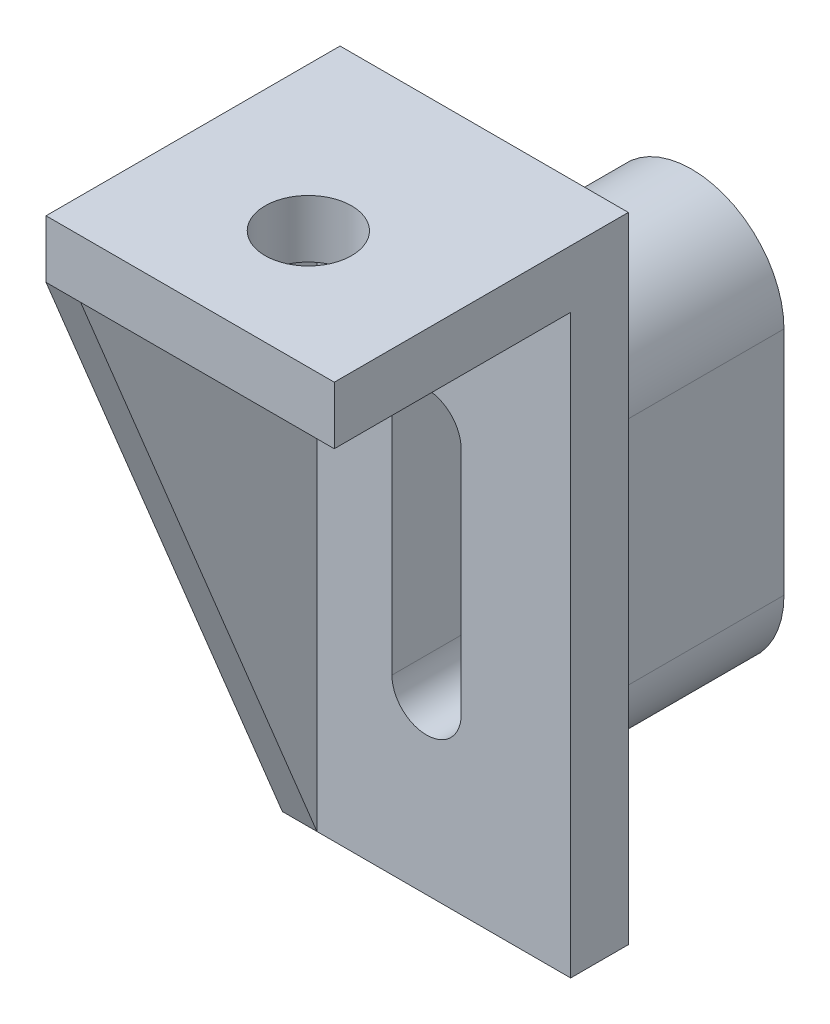
ISO-10303-21;
HEADER;
FILE_DESCRIPTION(('STEP AP214'),'2;1');
FILE_NAME('part.step','',(''),(''),'','','');
FILE_SCHEMA(('AUTOMOTIVE_DESIGN { 1 0 10303 214 1 1 1 1 }'));
ENDSEC;
DATA;
#1=APPLICATION_CONTEXT('core data for automotive mechanical design processes');
#2=APPLICATION_PROTOCOL_DEFINITION('international standard','automotive_design',2000,#1);
#3=PRODUCT_CONTEXT('',#1,'mechanical');
#4=PRODUCT('Part','Part','',(#3));
#5=PRODUCT_RELATED_PRODUCT_CATEGORY('part','',(#4));
#6=PRODUCT_DEFINITION_FORMATION('','',#4);
#7=PRODUCT_DEFINITION_CONTEXT('part definition',#1,'design');
#8=PRODUCT_DEFINITION('design','',#6,#7);
#9=PRODUCT_DEFINITION_SHAPE('','',#8);
#10=(LENGTH_UNIT() NAMED_UNIT(*) SI_UNIT(.MILLI.,.METRE.));
#11=(NAMED_UNIT(*) PLANE_ANGLE_UNIT() SI_UNIT($,.RADIAN.));
#12=(NAMED_UNIT(*) SI_UNIT($,.STERADIAN.) SOLID_ANGLE_UNIT());
#13=UNCERTAINTY_MEASURE_WITH_UNIT(LENGTH_MEASURE(1.E-05),#10,'distance_accuracy_value','');
#14=(GEOMETRIC_REPRESENTATION_CONTEXT(3) GLOBAL_UNCERTAINTY_ASSIGNED_CONTEXT((#13)) GLOBAL_UNIT_ASSIGNED_CONTEXT((#10,
#11,#12)) REPRESENTATION_CONTEXT('',''));
#15=CARTESIAN_POINT('',(0.,0.,0.));
#16=DIRECTION('',(0.,0.,1.));
#17=DIRECTION('',(1.,0.,0.));
#18=AXIS2_PLACEMENT_3D('',#15,#16,#17);
#19=CARTESIAN_POINT('',(0.,0.,10.));
#20=DIRECTION('',(0.,0.,1.));
#21=DIRECTION('',(1.,0.,0.));
#22=AXIS2_PLACEMENT_3D('',#19,#20,#21);
#23=PLANE('',#22);
#24=CARTESIAN_POINT('',(0.,20.,10.));
#25=DIRECTION('',(0.,0.,1.));
#26=DIRECTION('',(1.,0.,0.));
#27=AXIS2_PLACEMENT_3D('',#24,#25,#26);
#28=CIRCLE('',#27,6.00000000000001);
#29=CARTESIAN_POINT('',(5.99999999999999,20.,10.));
#30=VERTEX_POINT('',#29);
#31=CARTESIAN_POINT('',(-6.00000000000002,20.,10.));
#32=VERTEX_POINT('',#31);
#33=EDGE_CURVE('E247',#30,#32,#28,.T.);
#34=ORIENTED_EDGE('',*,*,#33,.F.);
#35=DIRECTION('',(0.,1.,0.));
#36=VECTOR('',#35,1.);
#37=CARTESIAN_POINT('',(6.,0.,10.));
#38=LINE('',#37,#36);
#39=CARTESIAN_POINT('',(6.,-20.,10.));
#40=VERTEX_POINT('',#39);
#41=EDGE_CURVE('E250',#40,#30,#38,.T.);
#42=ORIENTED_EDGE('',*,*,#41,.F.);
#43=CARTESIAN_POINT('',(0.,-20.,10.));
#44=DIRECTION('',(0.,0.,1.));
#45=DIRECTION('',(1.,0.,0.));
#46=AXIS2_PLACEMENT_3D('',#43,#44,#45);
#47=CIRCLE('',#46,6.00000000000001);
#48=CARTESIAN_POINT('',(-6.00000000000001,-20.,10.));
#49=VERTEX_POINT('',#48);
#50=EDGE_CURVE('E254',#49,#40,#47,.T.);
#51=ORIENTED_EDGE('',*,*,#50,.F.);
#52=DIRECTION('',(0.,1.,0.));
#53=VECTOR('',#52,1.);
#54=CARTESIAN_POINT('',(-6.00000000000002,0.,10.));
#55=LINE('',#54,#53);
#56=EDGE_CURVE('E257',#49,#32,#55,.T.);
#57=ORIENTED_EDGE('',*,*,#56,.T.);
#58=EDGE_LOOP('',(#34,#42,#51,#57));
#59=FACE_BOUND('',#58,.T.);
#60=DIRECTION('',(1.,0.,0.));
#61=VECTOR('',#60,1.);
#62=CARTESIAN_POINT('',(0.,50.,10.));
#63=LINE('',#62,#61);
#64=CARTESIAN_POINT('',(-19.,50.,10.));
#65=VERTEX_POINT('',#64);
#66=CARTESIAN_POINT('',(25.,50.,10.));
#67=VERTEX_POINT('',#66);
#68=EDGE_CURVE('E41',#65,#67,#63,.T.);
#69=ORIENTED_EDGE('',*,*,#68,.F.);
#70=DIRECTION('',(0.,-1.,0.));
#71=VECTOR('',#70,1.);
#72=CARTESIAN_POINT('',(-19.,-50.,10.));
#73=LINE('',#72,#71);
#74=CARTESIAN_POINT('',(-19.,-50.,10.));
#75=VERTEX_POINT('',#74);
#76=EDGE_CURVE('E55',#65,#75,#73,.T.);
#77=ORIENTED_EDGE('',*,*,#76,.T.);
#78=DIRECTION('',(1.,0.,0.));
#79=VECTOR('',#78,1.);
#80=CARTESIAN_POINT('',(0.,-50.,10.));
#81=LINE('',#80,#79);
#82=CARTESIAN_POINT('',(25.,-50.,10.));
#83=VERTEX_POINT('',#82);
#84=EDGE_CURVE('E259',#75,#83,#81,.T.);
#85=ORIENTED_EDGE('',*,*,#84,.T.);
#86=DIRECTION('',(0.,1.,0.));
#87=VECTOR('',#86,1.);
#88=CARTESIAN_POINT('',(25.,0.,10.));
#89=LINE('',#88,#87);
#90=EDGE_CURVE('E261',#83,#67,#89,.T.);
#91=ORIENTED_EDGE('',*,*,#90,.T.);
#92=EDGE_LOOP('',(#69,#77,#85,#91));
#93=FACE_BOUND('',#92,.T.);
#94=ADVANCED_FACE('F37',(#59,#93),#23,.T.);
#95=CARTESIAN_POINT('',(25.,50.,51.));
#96=DIRECTION('',(0.,-1.,0.));
#97=DIRECTION('',(0.,0.,-1.));
#98=AXIS2_PLACEMENT_3D('',#95,#96,#97);
#99=PLANE('',#98);
#100=CARTESIAN_POINT('',(0.,50.,30.5));
#101=DIRECTION('',(0.,-1.,0.));
#102=DIRECTION('',(0.,0.,-1.));
#103=AXIS2_PLACEMENT_3D('',#100,#101,#102);
#104=CIRCLE('',#103,7.5);
#105=CARTESIAN_POINT('',(0.,50.,23.));
#106=VERTEX_POINT('',#105);
#107=EDGE_CURVE('E169',#106,#106,#104,.T.);
#108=ORIENTED_EDGE('',*,*,#107,.F.);
#109=EDGE_LOOP('',(#108));
#110=FACE_BOUND('',#109,.T.);
#111=DIRECTION('',(-1.,0.,0.));
#112=VECTOR('',#111,1.);
#113=CARTESIAN_POINT('',(25.,50.,51.));
#114=LINE('',#113,#112);
#115=CARTESIAN_POINT('',(25.,50.,51.));
#116=VERTEX_POINT('',#115);
#117=CARTESIAN_POINT('',(-19.,50.,51.));
#118=VERTEX_POINT('',#117);
#119=EDGE_CURVE('E159',#116,#118,#114,.T.);
#120=ORIENTED_EDGE('',*,*,#119,.T.);
#121=DIRECTION('',(0.,0.,-1.));
#122=VECTOR('',#121,1.);
#123=CARTESIAN_POINT('',(-19.,50.,10.));
#124=LINE('',#123,#122);
#125=EDGE_CURVE('E63',#118,#65,#124,.T.);
#126=ORIENTED_EDGE('',*,*,#125,.T.);
#127=ORIENTED_EDGE('',*,*,#68,.T.);
#128=DIRECTION('',(0.,0.,-1.));
#129=VECTOR('',#128,1.);
#130=CARTESIAN_POINT('',(25.,50.,51.));
#131=LINE('',#130,#129);
#132=EDGE_CURVE('E190',#116,#67,#131,.T.);
#133=ORIENTED_EDGE('',*,*,#132,.F.);
#134=EDGE_LOOP('',(#120,#126,#127,#133));
#135=FACE_BOUND('',#134,.T.);
#136=ADVANCED_FACE('F281',(#110,#135),#99,.T.);
#137=CARTESIAN_POINT('',(0.,0.,0.));
#138=DIRECTION('',(0.,0.,1.));
#139=DIRECTION('',(1.,0.,0.));
#140=AXIS2_PLACEMENT_3D('',#137,#138,#139);
#141=PLANE('',#140);
#142=DIRECTION('',(1.,0.,0.));
#143=VECTOR('',#142,1.);
#144=CARTESIAN_POINT('',(0.,-50.,0.));
#145=LINE('',#144,#143);
#146=CARTESIAN_POINT('',(-25.,-50.,0.));
#147=VERTEX_POINT('',#146);
#148=CARTESIAN_POINT('',(25.,-50.,0.));
#149=VERTEX_POINT('',#148);
#150=EDGE_CURVE('E240',#147,#149,#145,.T.);
#151=ORIENTED_EDGE('',*,*,#150,.F.);
#152=DIRECTION('',(0.,1.,0.));
#153=VECTOR('',#152,1.);
#154=CARTESIAN_POINT('',(-25.,0.,0.));
#155=LINE('',#154,#153);
#156=CARTESIAN_POINT('',(-25.,60.,0.));
#157=VERTEX_POINT('',#156);
#158=EDGE_CURVE('E251',#147,#157,#155,.T.);
#159=ORIENTED_EDGE('',*,*,#158,.T.);
#160=DIRECTION('',(1.,0.,0.));
#161=VECTOR('',#160,1.);
#162=CARTESIAN_POINT('',(25.,60.,0.));
#163=LINE('',#162,#161);
#164=CARTESIAN_POINT('',(25.,60.,0.));
#165=VERTEX_POINT('',#164);
#166=EDGE_CURVE('E182',#157,#165,#163,.T.);
#167=ORIENTED_EDGE('',*,*,#166,.T.);
#168=DIRECTION('',(0.,1.,0.));
#169=VECTOR('',#168,1.);
#170=CARTESIAN_POINT('',(25.,0.,0.));
#171=LINE('',#170,#169);
#172=EDGE_CURVE('E266',#149,#165,#171,.T.);
#173=ORIENTED_EDGE('',*,*,#172,.F.);
#174=EDGE_LOOP('',(#151,#159,#167,#173));
#175=FACE_BOUND('',#174,.T.);
#176=DIRECTION('',(0.,1.,0.));
#177=VECTOR('',#176,1.);
#178=CARTESIAN_POINT('',(-16.,0.,0.));
#179=LINE('',#178,#177);
#180=CARTESIAN_POINT('',(-16.,-20.,0.));
#181=VERTEX_POINT('',#180);
#182=CARTESIAN_POINT('',(-16.,20.,0.));
#183=VERTEX_POINT('',#182);
#184=EDGE_CURVE('E196',#181,#183,#179,.T.);
#185=ORIENTED_EDGE('',*,*,#184,.F.);
#186=CARTESIAN_POINT('',(0.,-20.,0.));
#187=DIRECTION('',(0.,0.,1.));
#188=DIRECTION('',(1.,0.,0.));
#189=AXIS2_PLACEMENT_3D('',#186,#187,#188);
#190=CIRCLE('',#189,16.);
#191=CARTESIAN_POINT('',(16.,-20.,0.));
#192=VERTEX_POINT('',#191);
#193=EDGE_CURVE('E230',#181,#192,#190,.T.);
#194=ORIENTED_EDGE('',*,*,#193,.T.);
#195=DIRECTION('',(0.,1.,0.));
#196=VECTOR('',#195,1.);
#197=CARTESIAN_POINT('',(16.,0.,0.));
#198=LINE('',#197,#196);
#199=CARTESIAN_POINT('',(16.,20.,0.));
#200=VERTEX_POINT('',#199);
#201=EDGE_CURVE('E233',#192,#200,#198,.T.);
#202=ORIENTED_EDGE('',*,*,#201,.T.);
#203=CARTESIAN_POINT('',(0.,20.,0.));
#204=DIRECTION('',(0.,0.,1.));
#205=DIRECTION('',(1.,0.,0.));
#206=AXIS2_PLACEMENT_3D('',#203,#204,#205);
#207=CIRCLE('',#206,16.);
#208=EDGE_CURVE('E207',#200,#183,#207,.T.);
#209=ORIENTED_EDGE('',*,*,#208,.T.);
#210=EDGE_LOOP('',(#185,#194,#202,#209));
#211=FACE_BOUND('',#210,.T.);
#212=ADVANCED_FACE('F297',(#175,#211),#141,.F.);
#213=CARTESIAN_POINT('',(0.,-50.,10.));
#214=DIRECTION('',(0.,1.,0.));
#215=DIRECTION('',(0.,0.,1.));
#216=AXIS2_PLACEMENT_3D('',#213,#214,#215);
#217=PLANE('',#216);
#218=ORIENTED_EDGE('',*,*,#150,.T.);
#219=DIRECTION('',(0.,0.,-1.));
#220=VECTOR('',#219,1.);
#221=CARTESIAN_POINT('',(25.,-50.,10.));
#222=LINE('',#221,#220);
#223=EDGE_CURVE('E11',#83,#149,#222,.T.);
#224=ORIENTED_EDGE('',*,*,#223,.F.);
#225=ORIENTED_EDGE('',*,*,#84,.F.);
#226=CARTESIAN_POINT('',(-25.,-50.,10.));
#227=VERTEX_POINT('',#226);
#228=EDGE_CURVE('E260',#227,#75,#81,.T.);
#229=ORIENTED_EDGE('',*,*,#228,.F.);
#230=DIRECTION('',(0.,0.,-1.));
#231=VECTOR('',#230,1.);
#232=CARTESIAN_POINT('',(-25.,-50.,10.));
#233=LINE('',#232,#231);
#234=EDGE_CURVE('E47',#227,#147,#233,.T.);
#235=ORIENTED_EDGE('',*,*,#234,.T.);
#236=EDGE_LOOP('',(#218,#224,#225,#229,#235));
#237=FACE_BOUND('',#236,.T.);
#238=ADVANCED_FACE('F307',(#237),#217,.F.);
#239=CARTESIAN_POINT('',(25.,0.,10.));
#240=DIRECTION('',(-1.,0.,0.));
#241=DIRECTION('',(0.,0.,1.));
#242=AXIS2_PLACEMENT_3D('',#239,#240,#241);
#243=PLANE('',#242);
#244=ORIENTED_EDGE('',*,*,#172,.T.);
#245=DIRECTION('',(0.,0.,-1.));
#246=VECTOR('',#245,1.);
#247=CARTESIAN_POINT('',(25.,60.,51.));
#248=LINE('',#247,#246);
#249=CARTESIAN_POINT('',(25.,60.,51.));
#250=VERTEX_POINT('',#249);
#251=EDGE_CURVE('E193',#250,#165,#248,.T.);
#252=ORIENTED_EDGE('',*,*,#251,.F.);
#253=DIRECTION('',(0.,-1.,0.));
#254=VECTOR('',#253,1.);
#255=CARTESIAN_POINT('',(25.,50.,51.));
#256=LINE('',#255,#254);
#257=EDGE_CURVE('E185',#250,#116,#256,.T.);
#258=ORIENTED_EDGE('',*,*,#257,.T.);
#259=ORIENTED_EDGE('',*,*,#132,.T.);
#260=ORIENTED_EDGE('',*,*,#90,.F.);
#261=ORIENTED_EDGE('',*,*,#223,.T.);
#262=EDGE_LOOP('',(#244,#252,#258,#259,#260,#261));
#263=FACE_BOUND('',#262,.T.);
#264=ADVANCED_FACE('F312',(#263),#243,.F.);
#265=CARTESIAN_POINT('',(0.,20.,10.));
#266=DIRECTION('',(0.,0.,-1.));
#267=DIRECTION('',(-1.,0.,0.));
#268=AXIS2_PLACEMENT_3D('',#265,#266,#267);
#269=CYLINDRICAL_SURFACE('',#268,6.00000000000001);
#270=DIRECTION('',(0.,0.,-1.));
#271=VECTOR('',#270,1.);
#272=CARTESIAN_POINT('',(-6.00000000000002,20.,10.));
#273=LINE('',#272,#271);
#274=CARTESIAN_POINT('',(-6.00000000000002,20.,-36.));
#275=VERTEX_POINT('',#274);
#276=EDGE_CURVE('E271',#32,#275,#273,.T.);
#277=ORIENTED_EDGE('',*,*,#276,.T.);
#278=CARTESIAN_POINT('',(0.,20.,-36.));
#279=DIRECTION('',(0.,0.,1.));
#280=DIRECTION('',(1.,0.,0.));
#281=AXIS2_PLACEMENT_3D('',#278,#279,#280);
#282=CIRCLE('',#281,6.00000000000001);
#283=CARTESIAN_POINT('',(5.99999999999999,20.,-36.));
#284=VERTEX_POINT('',#283);
#285=EDGE_CURVE('E203',#284,#275,#282,.T.);
#286=ORIENTED_EDGE('',*,*,#285,.F.);
#287=DIRECTION('',(0.,0.,-1.));
#288=VECTOR('',#287,1.);
#289=CARTESIAN_POINT('',(5.99999999999999,20.,10.));
#290=LINE('',#289,#288);
#291=EDGE_CURVE('E269',#30,#284,#290,.T.);
#292=ORIENTED_EDGE('',*,*,#291,.F.);
#293=ORIENTED_EDGE('',*,*,#33,.T.);
#294=EDGE_LOOP('',(#277,#286,#292,#293));
#295=FACE_BOUND('',#294,.T.);
#296=ADVANCED_FACE('F39',(#295),#269,.F.);
#297=CARTESIAN_POINT('',(6.,0.,10.));
#298=DIRECTION('',(-1.,0.,0.));
#299=DIRECTION('',(0.,-1.,0.));
#300=AXIS2_PLACEMENT_3D('',#297,#298,#299);
#301=PLANE('',#300);
#302=ORIENTED_EDGE('',*,*,#291,.T.);
#303=DIRECTION('',(0.,1.,0.));
#304=VECTOR('',#303,1.);
#305=CARTESIAN_POINT('',(6.,0.,-36.));
#306=LINE('',#305,#304);
#307=CARTESIAN_POINT('',(6.,-20.,-36.));
#308=VERTEX_POINT('',#307);
#309=EDGE_CURVE('E206',#308,#284,#306,.T.);
#310=ORIENTED_EDGE('',*,*,#309,.F.);
#311=DIRECTION('',(0.,0.,-1.));
#312=VECTOR('',#311,1.);
#313=CARTESIAN_POINT('',(6.,-20.,10.));
#314=LINE('',#313,#312);
#315=EDGE_CURVE('E275',#40,#308,#314,.T.);
#316=ORIENTED_EDGE('',*,*,#315,.F.);
#317=ORIENTED_EDGE('',*,*,#41,.T.);
#318=EDGE_LOOP('',(#302,#310,#316,#317));
#319=FACE_BOUND('',#318,.T.);
#320=ADVANCED_FACE('F324',(#319),#301,.T.);
#321=CARTESIAN_POINT('',(0.,-20.,10.));
#322=DIRECTION('',(0.,0.,-1.));
#323=DIRECTION('',(-1.,0.,0.));
#324=AXIS2_PLACEMENT_3D('',#321,#322,#323);
#325=CYLINDRICAL_SURFACE('',#324,6.00000000000001);
#326=ORIENTED_EDGE('',*,*,#315,.T.);
#327=CARTESIAN_POINT('',(0.,-20.,-36.));
#328=DIRECTION('',(0.,0.,1.));
#329=DIRECTION('',(1.,0.,0.));
#330=AXIS2_PLACEMENT_3D('',#327,#328,#329);
#331=CIRCLE('',#330,6.00000000000001);
#332=CARTESIAN_POINT('',(-6.00000000000001,-20.,-36.));
#333=VERTEX_POINT('',#332);
#334=EDGE_CURVE('E210',#333,#308,#331,.T.);
#335=ORIENTED_EDGE('',*,*,#334,.F.);
#336=DIRECTION('',(0.,0.,-1.));
#337=VECTOR('',#336,1.);
#338=CARTESIAN_POINT('',(-6.00000000000001,-20.,10.));
#339=LINE('',#338,#337);
#340=EDGE_CURVE('E273',#49,#333,#339,.T.);
#341=ORIENTED_EDGE('',*,*,#340,.F.);
#342=ORIENTED_EDGE('',*,*,#50,.T.);
#343=EDGE_LOOP('',(#326,#335,#341,#342));
#344=FACE_BOUND('',#343,.T.);
#345=ADVANCED_FACE('F321',(#344),#325,.F.);
#346=CARTESIAN_POINT('',(-6.00000000000002,0.,10.));
#347=DIRECTION('',(-1.,0.,0.));
#348=DIRECTION('',(0.,-1.,0.));
#349=AXIS2_PLACEMENT_3D('',#346,#347,#348);
#350=PLANE('',#349);
#351=ORIENTED_EDGE('',*,*,#340,.T.);
#352=DIRECTION('',(0.,1.,0.));
#353=VECTOR('',#352,1.);
#354=CARTESIAN_POINT('',(-6.00000000000002,0.,-36.));
#355=LINE('',#354,#353);
#356=EDGE_CURVE('E213',#333,#275,#355,.T.);
#357=ORIENTED_EDGE('',*,*,#356,.T.);
#358=ORIENTED_EDGE('',*,*,#276,.F.);
#359=ORIENTED_EDGE('',*,*,#56,.F.);
#360=EDGE_LOOP('',(#351,#357,#358,#359));
#361=FACE_BOUND('',#360,.T.);
#362=ADVANCED_FACE('F311',(#361),#350,.F.);
#363=CARTESIAN_POINT('',(-25.,0.,10.));
#364=DIRECTION('',(-1.,0.,0.));
#365=DIRECTION('',(0.,0.,1.));
#366=AXIS2_PLACEMENT_3D('',#363,#364,#365);
#367=PLANE('',#366);
#368=ORIENTED_EDGE('',*,*,#158,.F.);
#369=ORIENTED_EDGE('',*,*,#234,.F.);
#370=DIRECTION('',(0.,0.925251905208399,0.379353281135444));
#371=VECTOR('',#370,1.);
#372=CARTESIAN_POINT('',(-25.,50.,51.));
#373=LINE('',#372,#371);
#374=CARTESIAN_POINT('',(-25.,50.,51.));
#375=VERTEX_POINT('',#374);
#376=EDGE_CURVE('E166',#227,#375,#373,.T.);
#377=ORIENTED_EDGE('',*,*,#376,.T.);
#378=DIRECTION('',(0.,1.,0.));
#379=VECTOR('',#378,1.);
#380=CARTESIAN_POINT('',(-25.,50.,51.));
#381=LINE('',#380,#379);
#382=CARTESIAN_POINT('',(-25.,60.,51.));
#383=VERTEX_POINT('',#382);
#384=EDGE_CURVE('E148',#375,#383,#381,.T.);
#385=ORIENTED_EDGE('',*,*,#384,.T.);
#386=DIRECTION('',(0.,0.,-1.));
#387=VECTOR('',#386,1.);
#388=CARTESIAN_POINT('',(-25.,60.,51.));
#389=LINE('',#388,#387);
#390=EDGE_CURVE('E197',#383,#157,#389,.T.);
#391=ORIENTED_EDGE('',*,*,#390,.T.);
#392=EDGE_LOOP('',(#368,#369,#377,#385,#391));
#393=FACE_BOUND('',#392,.T.);
#394=ADVANCED_FACE('F172',(#393),#367,.T.);
#395=CARTESIAN_POINT('',(-16.,0.,-36.));
#396=DIRECTION('',(1.,0.,0.));
#397=DIRECTION('',(0.,0.,-1.));
#398=AXIS2_PLACEMENT_3D('',#395,#396,#397);
#399=PLANE('',#398);
#400=ORIENTED_EDGE('',*,*,#184,.T.);
#401=DIRECTION('',(0.,0.,1.));
#402=VECTOR('',#401,1.);
#403=CARTESIAN_POINT('',(-16.,20.,-36.));
#404=LINE('',#403,#402);
#405=CARTESIAN_POINT('',(-16.,20.,-36.));
#406=VERTEX_POINT('',#405);
#407=EDGE_CURVE('E238',#406,#183,#404,.T.);
#408=ORIENTED_EDGE('',*,*,#407,.F.);
#409=DIRECTION('',(0.,1.,0.));
#410=VECTOR('',#409,1.);
#411=CARTESIAN_POINT('',(-16.,0.,-36.));
#412=LINE('',#411,#410);
#413=CARTESIAN_POINT('',(-16.,-20.,-36.));
#414=VERTEX_POINT('',#413);
#415=EDGE_CURVE('E216',#414,#406,#412,.T.);
#416=ORIENTED_EDGE('',*,*,#415,.F.);
#417=DIRECTION('',(0.,0.,1.));
#418=VECTOR('',#417,1.);
#419=CARTESIAN_POINT('',(-16.,-20.,-36.));
#420=LINE('',#419,#418);
#421=EDGE_CURVE('E227',#414,#181,#420,.T.);
#422=ORIENTED_EDGE('',*,*,#421,.T.);
#423=EDGE_LOOP('',(#400,#408,#416,#422));
#424=FACE_BOUND('',#423,.T.);
#425=ADVANCED_FACE('F303',(#424),#399,.F.);
#426=CARTESIAN_POINT('',(0.,20.,-36.));
#427=DIRECTION('',(0.,0.,1.));
#428=DIRECTION('',(1.,0.,0.));
#429=AXIS2_PLACEMENT_3D('',#426,#427,#428);
#430=CYLINDRICAL_SURFACE('',#429,16.);
#431=ORIENTED_EDGE('',*,*,#208,.F.);
#432=DIRECTION('',(0.,0.,1.));
#433=VECTOR('',#432,1.);
#434=CARTESIAN_POINT('',(16.,20.,-36.));
#435=LINE('',#434,#433);
#436=CARTESIAN_POINT('',(16.,20.,-36.));
#437=VERTEX_POINT('',#436);
#438=EDGE_CURVE('E241',#437,#200,#435,.T.);
#439=ORIENTED_EDGE('',*,*,#438,.F.);
#440=CARTESIAN_POINT('',(0.,20.,-36.));
#441=DIRECTION('',(0.,0.,1.));
#442=DIRECTION('',(1.,0.,0.));
#443=AXIS2_PLACEMENT_3D('',#440,#441,#442);
#444=CIRCLE('',#443,16.);
#445=EDGE_CURVE('E224',#437,#406,#444,.T.);
#446=ORIENTED_EDGE('',*,*,#445,.T.);
#447=ORIENTED_EDGE('',*,*,#407,.T.);
#448=EDGE_LOOP('',(#431,#439,#446,#447));
#449=FACE_BOUND('',#448,.T.);
#450=ADVANCED_FACE('F356',(#449),#430,.T.);
#451=CARTESIAN_POINT('',(16.,0.,-36.));
#452=DIRECTION('',(1.,0.,0.));
#453=DIRECTION('',(0.,1.,0.));
#454=AXIS2_PLACEMENT_3D('',#451,#452,#453);
#455=PLANE('',#454);
#456=ORIENTED_EDGE('',*,*,#201,.F.);
#457=DIRECTION('',(0.,0.,1.));
#458=VECTOR('',#457,1.);
#459=CARTESIAN_POINT('',(16.,-20.,-36.));
#460=LINE('',#459,#458);
#461=CARTESIAN_POINT('',(16.,-20.,-36.));
#462=VERTEX_POINT('',#461);
#463=EDGE_CURVE('E243',#462,#192,#460,.T.);
#464=ORIENTED_EDGE('',*,*,#463,.F.);
#465=DIRECTION('',(0.,1.,0.));
#466=VECTOR('',#465,1.);
#467=CARTESIAN_POINT('',(16.,0.,-36.));
#468=LINE('',#467,#466);
#469=EDGE_CURVE('E221',#462,#437,#468,.T.);
#470=ORIENTED_EDGE('',*,*,#469,.T.);
#471=ORIENTED_EDGE('',*,*,#438,.T.);
#472=EDGE_LOOP('',(#456,#464,#470,#471));
#473=FACE_BOUND('',#472,.T.);
#474=ADVANCED_FACE('F358',(#473),#455,.T.);
#475=CARTESIAN_POINT('',(0.,-20.,-36.));
#476=DIRECTION('',(0.,0.,1.));
#477=DIRECTION('',(1.,0.,0.));
#478=AXIS2_PLACEMENT_3D('',#475,#476,#477);
#479=CYLINDRICAL_SURFACE('',#478,16.);
#480=ORIENTED_EDGE('',*,*,#193,.F.);
#481=ORIENTED_EDGE('',*,*,#421,.F.);
#482=CARTESIAN_POINT('',(0.,-20.,-36.));
#483=DIRECTION('',(0.,0.,1.));
#484=DIRECTION('',(1.,0.,0.));
#485=AXIS2_PLACEMENT_3D('',#482,#483,#484);
#486=CIRCLE('',#485,16.);
#487=EDGE_CURVE('E218',#414,#462,#486,.T.);
#488=ORIENTED_EDGE('',*,*,#487,.T.);
#489=ORIENTED_EDGE('',*,*,#463,.T.);
#490=EDGE_LOOP('',(#480,#481,#488,#489));
#491=FACE_BOUND('',#490,.T.);
#492=ADVANCED_FACE('F345',(#491),#479,.T.);
#493=CARTESIAN_POINT('',(0.,0.,-36.));
#494=DIRECTION('',(0.,0.,1.));
#495=DIRECTION('',(1.,0.,0.));
#496=AXIS2_PLACEMENT_3D('',#493,#494,#495);
#497=PLANE('',#496);
#498=ORIENTED_EDGE('',*,*,#285,.T.);
#499=ORIENTED_EDGE('',*,*,#356,.F.);
#500=ORIENTED_EDGE('',*,*,#334,.T.);
#501=ORIENTED_EDGE('',*,*,#309,.T.);
#502=EDGE_LOOP('',(#498,#499,#500,#501));
#503=FACE_BOUND('',#502,.T.);
#504=ORIENTED_EDGE('',*,*,#415,.T.);
#505=ORIENTED_EDGE('',*,*,#445,.F.);
#506=ORIENTED_EDGE('',*,*,#469,.F.);
#507=ORIENTED_EDGE('',*,*,#487,.F.);
#508=EDGE_LOOP('',(#504,#505,#506,#507));
#509=FACE_BOUND('',#508,.T.);
#510=ADVANCED_FACE('F336',(#503,#509),#497,.F.);
#511=CARTESIAN_POINT('',(25.,60.,51.));
#512=DIRECTION('',(0.,1.,0.));
#513=DIRECTION('',(0.,0.,1.));
#514=AXIS2_PLACEMENT_3D('',#511,#512,#513);
#515=PLANE('',#514);
#516=CARTESIAN_POINT('',(0.,60.,30.5));
#517=DIRECTION('',(0.,-1.,0.));
#518=DIRECTION('',(0.,0.,-1.));
#519=AXIS2_PLACEMENT_3D('',#516,#517,#518);
#520=CIRCLE('',#519,7.5);
#521=CARTESIAN_POINT('',(0.,60.,23.));
#522=VERTEX_POINT('',#521);
#523=EDGE_CURVE('E179',#522,#522,#520,.T.);
#524=ORIENTED_EDGE('',*,*,#523,.T.);
#525=EDGE_LOOP('',(#524));
#526=FACE_BOUND('',#525,.T.);
#527=ORIENTED_EDGE('',*,*,#166,.F.);
#528=ORIENTED_EDGE('',*,*,#390,.F.);
#529=DIRECTION('',(1.,0.,0.));
#530=VECTOR('',#529,1.);
#531=CARTESIAN_POINT('',(25.,60.,51.));
#532=LINE('',#531,#530);
#533=EDGE_CURVE('E155',#383,#250,#532,.T.);
#534=ORIENTED_EDGE('',*,*,#533,.T.);
#535=ORIENTED_EDGE('',*,*,#251,.T.);
#536=EDGE_LOOP('',(#527,#528,#534,#535));
#537=FACE_BOUND('',#536,.T.);
#538=ADVANCED_FACE('F344',(#526,#537),#515,.T.);
#539=CARTESIAN_POINT('',(0.,0.,51.));
#540=DIRECTION('',(0.,0.,1.));
#541=DIRECTION('',(1.,0.,0.));
#542=AXIS2_PLACEMENT_3D('',#539,#540,#541);
#543=PLANE('',#542);
#544=ORIENTED_EDGE('',*,*,#257,.F.);
#545=ORIENTED_EDGE('',*,*,#533,.F.);
#546=ORIENTED_EDGE('',*,*,#384,.F.);
#547=DIRECTION('',(-1.,0.,0.));
#548=VECTOR('',#547,1.);
#549=CARTESIAN_POINT('',(-19.,50.,51.));
#550=LINE('',#549,#548);
#551=EDGE_CURVE('E153',#118,#375,#550,.T.);
#552=ORIENTED_EDGE('',*,*,#551,.F.);
#553=ORIENTED_EDGE('',*,*,#119,.F.);
#554=EDGE_LOOP('',(#544,#545,#546,#552,#553));
#555=FACE_BOUND('',#554,.T.);
#556=ADVANCED_FACE('F151',(#555),#543,.T.);
#557=CARTESIAN_POINT('',(0.,60.,30.5));
#558=DIRECTION('',(0.,-1.,0.));
#559=DIRECTION('',(0.,0.,-1.));
#560=AXIS2_PLACEMENT_3D('',#557,#558,#559);
#561=CYLINDRICAL_SURFACE('',#560,7.5);
#562=ORIENTED_EDGE('',*,*,#523,.F.);
#563=EDGE_LOOP('',(#562));
#564=FACE_BOUND('',#563,.T.);
#565=ORIENTED_EDGE('',*,*,#107,.T.);
#566=EDGE_LOOP('',(#565));
#567=FACE_BOUND('',#566,.T.);
#568=ADVANCED_FACE('F289',(#564,#567),#561,.F.);
#569=CARTESIAN_POINT('',(-19.,50.,51.));
#570=DIRECTION('',(0.,-0.379353281135444,0.925251905208399));
#571=DIRECTION('',(0.,-0.9252519052084,-0.379353281135444));
#572=AXIS2_PLACEMENT_3D('',#569,#570,#571);
#573=PLANE('',#572);
#574=ORIENTED_EDGE('',*,*,#376,.F.);
#575=ORIENTED_EDGE('',*,*,#228,.T.);
#576=DIRECTION('',(0.,0.925251905208399,0.379353281135444));
#577=VECTOR('',#576,1.);
#578=CARTESIAN_POINT('',(-19.,50.,51.));
#579=LINE('',#578,#577);
#580=EDGE_CURVE('E168',#75,#118,#579,.T.);
#581=ORIENTED_EDGE('',*,*,#580,.T.);
#582=ORIENTED_EDGE('',*,*,#551,.T.);
#583=EDGE_LOOP('',(#574,#575,#581,#582));
#584=FACE_BOUND('',#583,.T.);
#585=ADVANCED_FACE('F164',(#584),#573,.T.);
#586=CARTESIAN_POINT('',(-19.,0.,0.));
#587=DIRECTION('',(-1.,0.,0.));
#588=DIRECTION('',(0.,0.,1.));
#589=AXIS2_PLACEMENT_3D('',#586,#587,#588);
#590=PLANE('',#589);
#591=ORIENTED_EDGE('',*,*,#125,.F.);
#592=ORIENTED_EDGE('',*,*,#580,.F.);
#593=ORIENTED_EDGE('',*,*,#76,.F.);
#594=EDGE_LOOP('',(#591,#592,#593));
#595=FACE_BOUND('',#594,.T.);
#596=ADVANCED_FACE('F283',(#595),#590,.F.);
#597=CLOSED_SHELL('',(#94,#136,#212,#238,#264,#296,#320,#345,#362,#394,#425,#450,#474,#492,#510,
#538,#556,#568,#585,#596));
#598=MANIFOLD_SOLID_BREP('B2',#597);
#599=ADVANCED_BREP_SHAPE_REPRESENTATION('',(#18,#598),#14);
#600=SHAPE_DEFINITION_REPRESENTATION(#9,#599);
ENDSEC;
END-ISO-10303-21;
